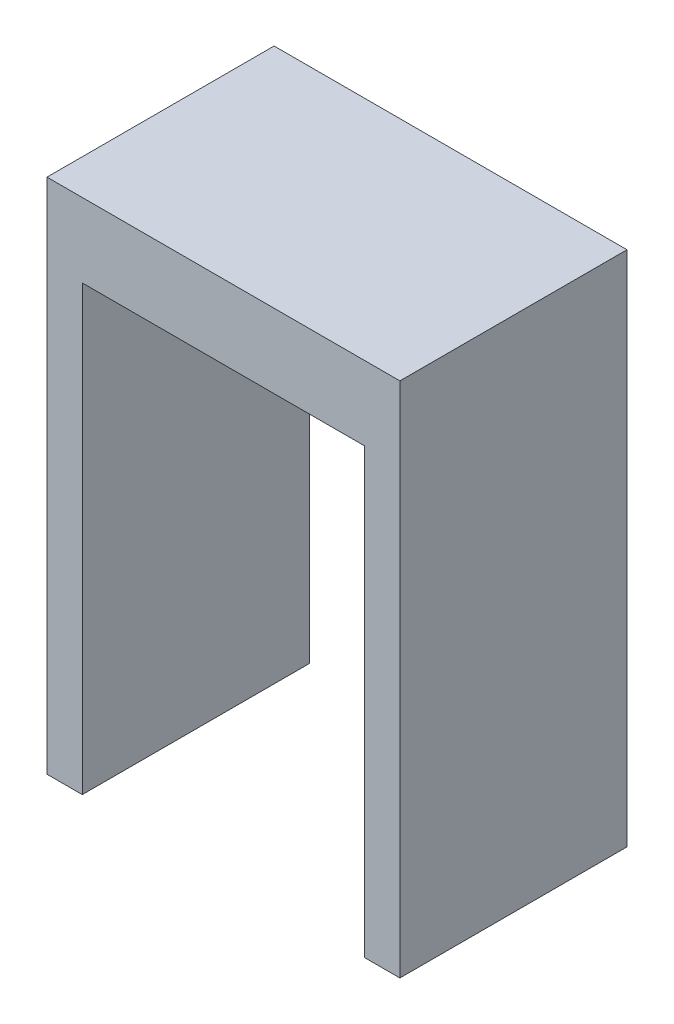
ISO-10303-21;
HEADER;
FILE_DESCRIPTION(('STEP AP214'),'2;1');
FILE_NAME('part.step','',(''),(''),'','','');
FILE_SCHEMA(('AUTOMOTIVE_DESIGN { 1 0 10303 214 1 1 1 1 }'));
ENDSEC;
DATA;
#1=APPLICATION_CONTEXT('core data for automotive mechanical design processes');
#2=APPLICATION_PROTOCOL_DEFINITION('international standard','automotive_design',2000,#1);
#3=PRODUCT_CONTEXT('',#1,'mechanical');
#4=PRODUCT('Part','Part','',(#3));
#5=PRODUCT_RELATED_PRODUCT_CATEGORY('part','',(#4));
#6=PRODUCT_DEFINITION_FORMATION('','',#4);
#7=PRODUCT_DEFINITION_CONTEXT('part definition',#1,'design');
#8=PRODUCT_DEFINITION('design','',#6,#7);
#9=PRODUCT_DEFINITION_SHAPE('','',#8);
#10=(LENGTH_UNIT() NAMED_UNIT(*) SI_UNIT(.MILLI.,.METRE.));
#11=(NAMED_UNIT(*) PLANE_ANGLE_UNIT() SI_UNIT($,.RADIAN.));
#12=(NAMED_UNIT(*) SI_UNIT($,.STERADIAN.) SOLID_ANGLE_UNIT());
#13=UNCERTAINTY_MEASURE_WITH_UNIT(LENGTH_MEASURE(1.E-05),#10,'distance_accuracy_value','');
#14=(GEOMETRIC_REPRESENTATION_CONTEXT(3) GLOBAL_UNCERTAINTY_ASSIGNED_CONTEXT((#13)) GLOBAL_UNIT_ASSIGNED_CONTEXT((#10,
#11,#12)) REPRESENTATION_CONTEXT('',''));
#15=CARTESIAN_POINT('',(0.,0.,0.));
#16=DIRECTION('',(0.,0.,1.));
#17=DIRECTION('',(1.,0.,0.));
#18=AXIS2_PLACEMENT_3D('',#15,#16,#17);
#19=CARTESIAN_POINT('',(9.75,-13.,10.));
#20=DIRECTION('',(-1.,0.,0.));
#21=DIRECTION('',(0.,0.,1.));
#22=AXIS2_PLACEMENT_3D('',#19,#20,#21);
#23=PLANE('',#22);
#24=DIRECTION('',(0.,0.,-1.));
#25=VECTOR('',#24,1.);
#26=CARTESIAN_POINT('',(9.75,14.4875,0.));
#27=LINE('',#26,#25);
#28=CARTESIAN_POINT('',(9.75,14.4875,12.55));
#29=VERTEX_POINT('',#28);
#30=CARTESIAN_POINT('',(9.75,14.4875,0.));
#31=VERTEX_POINT('',#30);
#32=EDGE_CURVE('E176',#29,#31,#27,.T.);
#33=ORIENTED_EDGE('',*,*,#32,.F.);
#34=DIRECTION('',(0.,1.,0.));
#35=VECTOR('',#34,1.);
#36=CARTESIAN_POINT('',(9.75,14.4875,12.55));
#37=LINE('',#36,#35);
#38=CARTESIAN_POINT('',(9.75,-14.0875,12.55));
#39=VERTEX_POINT('',#38);
#40=EDGE_CURVE('E149',#39,#29,#37,.T.);
#41=ORIENTED_EDGE('',*,*,#40,.F.);
#42=DIRECTION('',(0.,0.,1.));
#43=VECTOR('',#42,1.);
#44=CARTESIAN_POINT('',(9.75,-14.0875,10.));
#45=LINE('',#44,#43);
#46=CARTESIAN_POINT('',(9.75,-14.0875,0.));
#47=VERTEX_POINT('',#46);
#48=EDGE_CURVE('E166',#47,#39,#45,.T.);
#49=ORIENTED_EDGE('',*,*,#48,.F.);
#50=DIRECTION('',(0.,1.,0.));
#51=VECTOR('',#50,1.);
#52=CARTESIAN_POINT('',(9.75,-13.,0.));
#53=LINE('',#52,#51);
#54=EDGE_CURVE('E53',#47,#31,#53,.T.);
#55=ORIENTED_EDGE('',*,*,#54,.T.);
#56=EDGE_LOOP('',(#33,#41,#49,#55));
#57=FACE_BOUND('',#56,.T.);
#58=ADVANCED_FACE('F45',(#57),#23,.F.);
#59=CARTESIAN_POINT('',(-9.75,-13.,10.));
#60=DIRECTION('',(1.,0.,0.));
#61=DIRECTION('',(0.,0.,-1.));
#62=AXIS2_PLACEMENT_3D('',#59,#60,#61);
#63=PLANE('',#62);
#64=DIRECTION('',(0.,-1.,0.));
#65=VECTOR('',#64,1.);
#66=CARTESIAN_POINT('',(-9.75,-13.,0.));
#67=LINE('',#66,#65);
#68=CARTESIAN_POINT('',(-9.75,14.4875,0.));
#69=VERTEX_POINT('',#68);
#70=CARTESIAN_POINT('',(-9.75,-14.0875,0.));
#71=VERTEX_POINT('',#70);
#72=EDGE_CURVE('E11',#69,#71,#67,.T.);
#73=ORIENTED_EDGE('',*,*,#72,.T.);
#74=DIRECTION('',(0.,0.,-1.));
#75=VECTOR('',#74,1.);
#76=CARTESIAN_POINT('',(-9.75,-14.0875,10.));
#77=LINE('',#76,#75);
#78=CARTESIAN_POINT('',(-9.75,-14.0875,12.55));
#79=VERTEX_POINT('',#78);
#80=EDGE_CURVE('E169',#79,#71,#77,.T.);
#81=ORIENTED_EDGE('',*,*,#80,.F.);
#82=DIRECTION('',(0.,-1.,0.));
#83=VECTOR('',#82,1.);
#84=CARTESIAN_POINT('',(-9.75,-14.0875,12.55));
#85=LINE('',#84,#83);
#86=CARTESIAN_POINT('',(-9.75,14.4875,12.55));
#87=VERTEX_POINT('',#86);
#88=EDGE_CURVE('E135',#87,#79,#85,.T.);
#89=ORIENTED_EDGE('',*,*,#88,.F.);
#90=DIRECTION('',(0.,0.,1.));
#91=VECTOR('',#90,1.);
#92=CARTESIAN_POINT('',(-9.75,14.4875,0.));
#93=LINE('',#92,#91);
#94=EDGE_CURVE('E121',#69,#87,#93,.T.);
#95=ORIENTED_EDGE('',*,*,#94,.F.);
#96=EDGE_LOOP('',(#73,#81,#89,#95));
#97=FACE_BOUND('',#96,.T.);
#98=ADVANCED_FACE('F207',(#97),#63,.F.);
#99=CARTESIAN_POINT('',(0.,0.,0.));
#100=DIRECTION('',(0.,0.,-1.));
#101=DIRECTION('',(-1.,0.,0.));
#102=AXIS2_PLACEMENT_3D('',#99,#100,#101);
#103=PLANE('',#102);
#104=ORIENTED_EDGE('',*,*,#54,.F.);
#105=DIRECTION('',(1.,0.,0.));
#106=VECTOR('',#105,1.);
#107=CARTESIAN_POINT('',(9.75,-14.0875,0.));
#108=LINE('',#107,#106);
#109=CARTESIAN_POINT('',(7.8,-14.0875,0.));
#110=VERTEX_POINT('',#109);
#111=EDGE_CURVE('E158',#110,#47,#108,.T.);
#112=ORIENTED_EDGE('',*,*,#111,.F.);
#113=DIRECTION('',(0.,1.,0.));
#114=VECTOR('',#113,1.);
#115=CARTESIAN_POINT('',(7.8,-10.4,0.));
#116=LINE('',#115,#114);
#117=CARTESIAN_POINT('',(7.8,10.4,0.));
#118=VERTEX_POINT('',#117);
#119=EDGE_CURVE('E68',#110,#118,#116,.T.);
#120=ORIENTED_EDGE('',*,*,#119,.T.);
#121=DIRECTION('',(-1.,0.,0.));
#122=VECTOR('',#121,1.);
#123=CARTESIAN_POINT('',(-7.8,10.4,0.));
#124=LINE('',#123,#122);
#125=CARTESIAN_POINT('',(-7.8,10.4,0.));
#126=VERTEX_POINT('',#125);
#127=EDGE_CURVE('E192',#118,#126,#124,.T.);
#128=ORIENTED_EDGE('',*,*,#127,.T.);
#129=DIRECTION('',(0.,-1.,0.));
#130=VECTOR('',#129,1.);
#131=CARTESIAN_POINT('',(-7.8,-10.4,0.));
#132=LINE('',#131,#130);
#133=CARTESIAN_POINT('',(-7.8,-14.0875,0.));
#134=VERTEX_POINT('',#133);
#135=EDGE_CURVE('E184',#126,#134,#132,.T.);
#136=ORIENTED_EDGE('',*,*,#135,.T.);
#137=DIRECTION('',(1.,0.,0.));
#138=VECTOR('',#137,1.);
#139=CARTESIAN_POINT('',(-9.75,-14.0875,0.));
#140=LINE('',#139,#138);
#141=EDGE_CURVE('E118',#71,#134,#140,.T.);
#142=ORIENTED_EDGE('',*,*,#141,.F.);
#143=ORIENTED_EDGE('',*,*,#72,.F.);
#144=DIRECTION('',(-1.,0.,0.));
#145=VECTOR('',#144,1.);
#146=CARTESIAN_POINT('',(-9.75,14.4875,0.));
#147=LINE('',#146,#145);
#148=EDGE_CURVE('E180',#31,#69,#147,.T.);
#149=ORIENTED_EDGE('',*,*,#148,.F.);
#150=EDGE_LOOP('',(#104,#112,#120,#128,#136,#142,#143,#149));
#151=FACE_BOUND('',#150,.T.);
#152=ADVANCED_FACE('F205',(#151),#103,.T.);
#153=CARTESIAN_POINT('',(7.8,-10.4,-0.000999999999999265));
#154=DIRECTION('',(1.,0.,0.));
#155=DIRECTION('',(0.,0.,-1.));
#156=AXIS2_PLACEMENT_3D('',#153,#154,#155);
#157=PLANE('',#156);
#158=ORIENTED_EDGE('',*,*,#119,.F.);
#159=DIRECTION('',(0.,0.,-1.));
#160=VECTOR('',#159,1.);
#161=CARTESIAN_POINT('',(7.8,-14.0875,10.));
#162=LINE('',#161,#160);
#163=CARTESIAN_POINT('',(7.8,-14.0875,12.55));
#164=VERTEX_POINT('',#163);
#165=EDGE_CURVE('E162',#164,#110,#162,.T.);
#166=ORIENTED_EDGE('',*,*,#165,.F.);
#167=DIRECTION('',(0.,-1.,0.));
#168=VECTOR('',#167,1.);
#169=CARTESIAN_POINT('',(7.8,-14.0875,12.55));
#170=LINE('',#169,#168);
#171=CARTESIAN_POINT('',(7.8,10.4,12.55));
#172=VERTEX_POINT('',#171);
#173=EDGE_CURVE('E141',#172,#164,#170,.T.);
#174=ORIENTED_EDGE('',*,*,#173,.F.);
#175=DIRECTION('',(0.,0.,1.));
#176=VECTOR('',#175,1.);
#177=CARTESIAN_POINT('',(7.8,10.4,-0.000999999999999265));
#178=LINE('',#177,#176);
#179=EDGE_CURVE('E189',#118,#172,#178,.T.);
#180=ORIENTED_EDGE('',*,*,#179,.F.);
#181=EDGE_LOOP('',(#158,#166,#174,#180));
#182=FACE_BOUND('',#181,.T.);
#183=ADVANCED_FACE('F213',(#182),#157,.F.);
#184=CARTESIAN_POINT('',(-7.8,-10.4,-0.000999999999999265));
#185=DIRECTION('',(-1.,0.,0.));
#186=DIRECTION('',(0.,0.,1.));
#187=AXIS2_PLACEMENT_3D('',#184,#185,#186);
#188=PLANE('',#187);
#189=DIRECTION('',(0.,0.,1.));
#190=VECTOR('',#189,1.);
#191=CARTESIAN_POINT('',(-7.8,10.4,-0.000999999999999265));
#192=LINE('',#191,#190);
#193=CARTESIAN_POINT('',(-7.8,10.4,12.55));
#194=VERTEX_POINT('',#193);
#195=EDGE_CURVE('E60',#126,#194,#192,.T.);
#196=ORIENTED_EDGE('',*,*,#195,.T.);
#197=DIRECTION('',(0.,1.,0.));
#198=VECTOR('',#197,1.);
#199=CARTESIAN_POINT('',(-7.8,10.4,12.55));
#200=LINE('',#199,#198);
#201=CARTESIAN_POINT('',(-7.8,-14.0875,12.55));
#202=VERTEX_POINT('',#201);
#203=EDGE_CURVE('E124',#202,#194,#200,.T.);
#204=ORIENTED_EDGE('',*,*,#203,.F.);
#205=DIRECTION('',(0.,0.,1.));
#206=VECTOR('',#205,1.);
#207=CARTESIAN_POINT('',(-7.8,-14.0875,10.));
#208=LINE('',#207,#206);
#209=EDGE_CURVE('E111',#134,#202,#208,.T.);
#210=ORIENTED_EDGE('',*,*,#209,.F.);
#211=ORIENTED_EDGE('',*,*,#135,.F.);
#212=EDGE_LOOP('',(#196,#204,#210,#211));
#213=FACE_BOUND('',#212,.T.);
#214=ADVANCED_FACE('F125',(#213),#188,.F.);
#215=CARTESIAN_POINT('',(-7.8,10.4,-0.000999999999999265));
#216=DIRECTION('',(0.,1.,0.));
#217=DIRECTION('',(0.,0.,1.));
#218=AXIS2_PLACEMENT_3D('',#215,#216,#217);
#219=PLANE('',#218);
#220=ORIENTED_EDGE('',*,*,#179,.T.);
#221=DIRECTION('',(1.,0.,0.));
#222=VECTOR('',#221,1.);
#223=CARTESIAN_POINT('',(7.8,10.4,12.55));
#224=LINE('',#223,#222);
#225=EDGE_CURVE('E129',#194,#172,#224,.T.);
#226=ORIENTED_EDGE('',*,*,#225,.F.);
#227=ORIENTED_EDGE('',*,*,#195,.F.);
#228=ORIENTED_EDGE('',*,*,#127,.F.);
#229=EDGE_LOOP('',(#220,#226,#227,#228));
#230=FACE_BOUND('',#229,.T.);
#231=ADVANCED_FACE('F215',(#230),#219,.F.);
#232=CARTESIAN_POINT('',(0.,14.4875,0.));
#233=DIRECTION('',(0.,1.,0.));
#234=DIRECTION('',(0.,0.,1.));
#235=AXIS2_PLACEMENT_3D('',#232,#233,#234);
#236=PLANE('',#235);
#237=ORIENTED_EDGE('',*,*,#94,.T.);
#238=DIRECTION('',(-1.,0.,0.));
#239=VECTOR('',#238,1.);
#240=CARTESIAN_POINT('',(-9.75,14.4875,12.55));
#241=LINE('',#240,#239);
#242=EDGE_CURVE('E153',#29,#87,#241,.T.);
#243=ORIENTED_EDGE('',*,*,#242,.F.);
#244=ORIENTED_EDGE('',*,*,#32,.T.);
#245=ORIENTED_EDGE('',*,*,#148,.T.);
#246=EDGE_LOOP('',(#237,#243,#244,#245));
#247=FACE_BOUND('',#246,.T.);
#248=ADVANCED_FACE('F203',(#247),#236,.T.);
#249=CARTESIAN_POINT('',(0.,-14.0875,0.));
#250=DIRECTION('',(0.,-1.,0.));
#251=DIRECTION('',(0.,0.,-1.));
#252=AXIS2_PLACEMENT_3D('',#249,#250,#251);
#253=PLANE('',#252);
#254=ORIENTED_EDGE('',*,*,#80,.T.);
#255=ORIENTED_EDGE('',*,*,#141,.T.);
#256=ORIENTED_EDGE('',*,*,#209,.T.);
#257=DIRECTION('',(1.,0.,0.));
#258=VECTOR('',#257,1.);
#259=CARTESIAN_POINT('',(-7.8,-14.0875,12.55));
#260=LINE('',#259,#258);
#261=EDGE_CURVE('E116',#79,#202,#260,.T.);
#262=ORIENTED_EDGE('',*,*,#261,.F.);
#263=EDGE_LOOP('',(#254,#255,#256,#262));
#264=FACE_BOUND('',#263,.T.);
#265=ADVANCED_FACE('F114',(#264),#253,.T.);
#266=CARTESIAN_POINT('',(0.,-14.0875,0.));
#267=DIRECTION('',(0.,1.,0.));
#268=DIRECTION('',(0.,0.,1.));
#269=AXIS2_PLACEMENT_3D('',#266,#267,#268);
#270=PLANE('',#269);
#271=ORIENTED_EDGE('',*,*,#48,.T.);
#272=DIRECTION('',(1.,0.,0.));
#273=VECTOR('',#272,1.);
#274=CARTESIAN_POINT('',(9.75,-14.0875,12.55));
#275=LINE('',#274,#273);
#276=EDGE_CURVE('E145',#164,#39,#275,.T.);
#277=ORIENTED_EDGE('',*,*,#276,.F.);
#278=ORIENTED_EDGE('',*,*,#165,.T.);
#279=ORIENTED_EDGE('',*,*,#111,.T.);
#280=EDGE_LOOP('',(#271,#277,#278,#279));
#281=FACE_BOUND('',#280,.T.);
#282=ADVANCED_FACE('F211',(#281),#270,.F.);
#283=CARTESIAN_POINT('',(0.,0.,12.55));
#284=DIRECTION('',(0.,0.,-1.));
#285=DIRECTION('',(-1.,0.,0.));
#286=AXIS2_PLACEMENT_3D('',#283,#284,#285);
#287=PLANE('',#286);
#288=ORIENTED_EDGE('',*,*,#261,.T.);
#289=ORIENTED_EDGE('',*,*,#203,.T.);
#290=ORIENTED_EDGE('',*,*,#225,.T.);
#291=ORIENTED_EDGE('',*,*,#173,.T.);
#292=ORIENTED_EDGE('',*,*,#276,.T.);
#293=ORIENTED_EDGE('',*,*,#40,.T.);
#294=ORIENTED_EDGE('',*,*,#242,.T.);
#295=ORIENTED_EDGE('',*,*,#88,.T.);
#296=EDGE_LOOP('',(#288,#289,#290,#291,#292,#293,#294,#295));
#297=FACE_BOUND('',#296,.T.);
#298=ADVANCED_FACE('F132',(#297),#287,.F.);
#299=CLOSED_SHELL('',(#58,#98,#152,#183,#214,#231,#248,#265,#282,#298));
#300=MANIFOLD_SOLID_BREP('B2',#299);
#301=ADVANCED_BREP_SHAPE_REPRESENTATION('',(#18,#300),#14);
#302=SHAPE_DEFINITION_REPRESENTATION(#9,#301);
ENDSEC;
END-ISO-10303-21;
